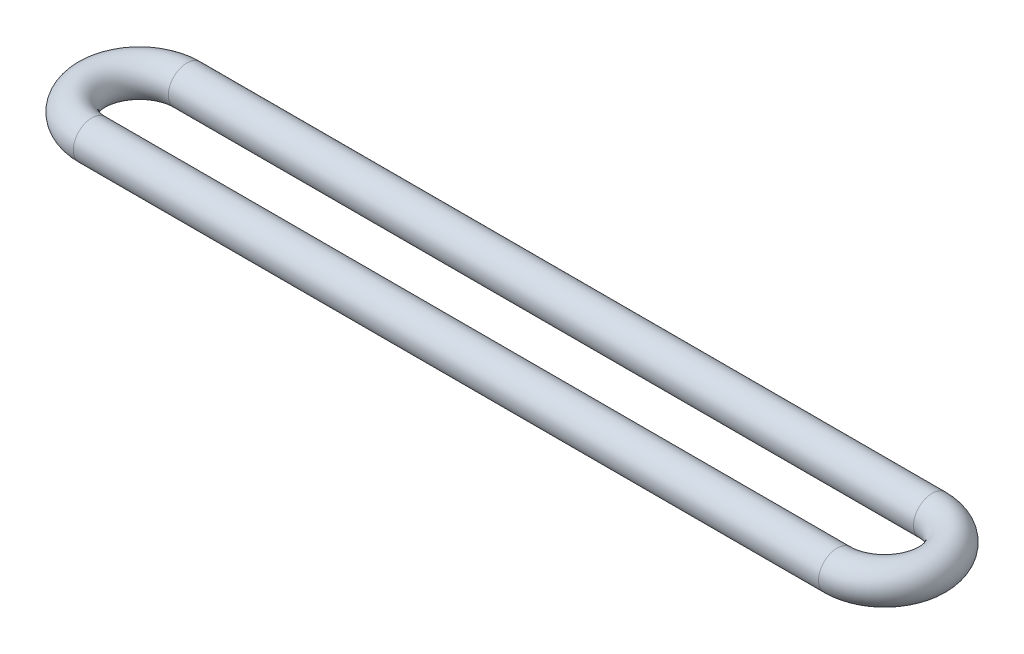
ISO-10303-21;
HEADER;
FILE_DESCRIPTION(('STEP AP214'),'2;1');
FILE_NAME('part.step','',(''),(''),'','','');
FILE_SCHEMA(('AUTOMOTIVE_DESIGN { 1 0 10303 214 1 1 1 1 }'));
ENDSEC;
DATA;
#1=APPLICATION_CONTEXT('core data for automotive mechanical design processes');
#2=APPLICATION_PROTOCOL_DEFINITION('international standard','automotive_design',2000,#1);
#3=PRODUCT_CONTEXT('',#1,'mechanical');
#4=PRODUCT('Part','Part','',(#3));
#5=PRODUCT_RELATED_PRODUCT_CATEGORY('part','',(#4));
#6=PRODUCT_DEFINITION_FORMATION('','',#4);
#7=PRODUCT_DEFINITION_CONTEXT('part definition',#1,'design');
#8=PRODUCT_DEFINITION('design','',#6,#7);
#9=PRODUCT_DEFINITION_SHAPE('','',#8);
#10=(LENGTH_UNIT() NAMED_UNIT(*) SI_UNIT(.MILLI.,.METRE.));
#11=(NAMED_UNIT(*) PLANE_ANGLE_UNIT() SI_UNIT($,.RADIAN.));
#12=(NAMED_UNIT(*) SI_UNIT($,.STERADIAN.) SOLID_ANGLE_UNIT());
#13=UNCERTAINTY_MEASURE_WITH_UNIT(LENGTH_MEASURE(1.E-05),#10,'distance_accuracy_value','');
#14=(GEOMETRIC_REPRESENTATION_CONTEXT(3) GLOBAL_UNCERTAINTY_ASSIGNED_CONTEXT((#13)) GLOBAL_UNIT_ASSIGNED_CONTEXT((#10,
#11,#12)) REPRESENTATION_CONTEXT('',''));
#15=CARTESIAN_POINT('',(0.,0.,0.));
#16=DIRECTION('',(0.,0.,1.));
#17=DIRECTION('',(1.,0.,0.));
#18=AXIS2_PLACEMENT_3D('',#15,#16,#17);
#19=CARTESIAN_POINT('',(0.,0.,2.55000000000001));
#20=DIRECTION('',(0.,-1.,0.));
#21=DIRECTION('',(0.,0.,-1.));
#22=AXIS2_PLACEMENT_3D('',#19,#20,#21);
#23=TOROIDAL_SURFACE('',#22,2.55000000000001,1.);
#24=CARTESIAN_POINT('',(0.,0.,5.10000000000001));
#25=DIRECTION('',(-1.,0.,0.));
#26=DIRECTION('',(0.,0.,1.));
#27=AXIS2_PLACEMENT_3D('',#24,#25,#26);
#28=CIRCLE('',#27,1.);
#29=CARTESIAN_POINT('',(0.,0.,6.10000000000001));
#30=VERTEX_POINT('',#29);
#31=EDGE_CURVE('E41',#30,#30,#28,.T.);
#32=ORIENTED_EDGE('',*,*,#31,.T.);
#33=EDGE_LOOP('',(#32));
#34=FACE_BOUND('',#33,.T.);
#35=CARTESIAN_POINT('',(0.,0.,0.));
#36=DIRECTION('',(1.,0.,0.));
#37=DIRECTION('',(0.,0.,-1.));
#38=AXIS2_PLACEMENT_3D('',#35,#36,#37);
#39=CIRCLE('',#38,1.);
#40=CARTESIAN_POINT('',(0.,0.,-1.));
#41=VERTEX_POINT('',#40);
#42=EDGE_CURVE('E10',#41,#41,#39,.T.);
#43=ORIENTED_EDGE('',*,*,#42,.F.);
#44=EDGE_LOOP('',(#43));
#45=FACE_BOUND('',#44,.T.);
#46=ADVANCED_FACE('F31',(#34,#45),#23,.T.);
#47=CARTESIAN_POINT('',(40.,0.,5.1));
#48=DIRECTION('',(-1.,0.,0.));
#49=DIRECTION('',(0.,0.,1.));
#50=AXIS2_PLACEMENT_3D('',#47,#48,#49);
#51=CYLINDRICAL_SURFACE('',#50,1.);
#52=CARTESIAN_POINT('',(40.,0.,5.1));
#53=DIRECTION('',(-1.,0.,0.));
#54=DIRECTION('',(0.,0.,1.));
#55=AXIS2_PLACEMENT_3D('',#52,#53,#54);
#56=CIRCLE('',#55,1.);
#57=CARTESIAN_POINT('',(40.,0.,6.1));
#58=VERTEX_POINT('',#57);
#59=EDGE_CURVE('E45',#58,#58,#56,.T.);
#60=ORIENTED_EDGE('',*,*,#59,.T.);
#61=EDGE_LOOP('',(#60));
#62=FACE_BOUND('',#61,.T.);
#63=ORIENTED_EDGE('',*,*,#31,.F.);
#64=EDGE_LOOP('',(#63));
#65=FACE_BOUND('',#64,.T.);
#66=ADVANCED_FACE('F64',(#62,#65),#51,.T.);
#67=CARTESIAN_POINT('',(40.,0.,2.55));
#68=DIRECTION('',(0.,-1.,0.));
#69=DIRECTION('',(0.,0.,-1.));
#70=AXIS2_PLACEMENT_3D('',#67,#68,#69);
#71=TOROIDAL_SURFACE('',#70,2.55,1.);
#72=CARTESIAN_POINT('',(40.,0.,0.));
#73=DIRECTION('',(1.,0.,0.));
#74=DIRECTION('',(0.,0.,-1.));
#75=AXIS2_PLACEMENT_3D('',#72,#73,#74);
#76=CIRCLE('',#75,1.);
#77=CARTESIAN_POINT('',(40.,0.,-1.));
#78=VERTEX_POINT('',#77);
#79=EDGE_CURVE('E50',#78,#78,#76,.T.);
#80=CARTESIAN_POINT('',(40.,0.,2.55));
#81=DIRECTION('',(0.,-1.,0.));
#82=DIRECTION('',(0.,0.,-1.));
#83=AXIS2_PLACEMENT_3D('',#80,#81,#82);
#84=CIRCLE('',#83,3.55);
#85=EDGE_CURVE('',#78,#58,#84,.T.);
#86=ORIENTED_EDGE('',*,*,#79,.T.);
#87=ORIENTED_EDGE('',*,*,#59,.F.);
#88=ORIENTED_EDGE('',*,*,#85,.T.);
#89=ORIENTED_EDGE('',*,*,#85,.F.);
#90=EDGE_LOOP('',(#86,#88,#87,#89));
#91=FACE_BOUND('',#90,.T.);
#92=ADVANCED_FACE('F68',(#91),#71,.T.);
#93=CARTESIAN_POINT('',(40.,0.,0.));
#94=DIRECTION('',(-1.,0.,0.));
#95=DIRECTION('',(0.,0.,1.));
#96=AXIS2_PLACEMENT_3D('',#93,#94,#95);
#97=CYLINDRICAL_SURFACE('',#96,1.);
#98=ORIENTED_EDGE('',*,*,#79,.F.);
#99=EDGE_LOOP('',(#98));
#100=FACE_BOUND('',#99,.T.);
#101=ORIENTED_EDGE('',*,*,#42,.T.);
#102=EDGE_LOOP('',(#101));
#103=FACE_BOUND('',#102,.T.);
#104=ADVANCED_FACE('F73',(#100,#103),#97,.T.);
#105=CLOSED_SHELL('',(#46,#66,#92,#104));
#106=MANIFOLD_SOLID_BREP('B2',#105);
#107=ADVANCED_BREP_SHAPE_REPRESENTATION('',(#18,#106),#14);
#108=SHAPE_DEFINITION_REPRESENTATION(#9,#107);
ENDSEC;
END-ISO-10303-21;
